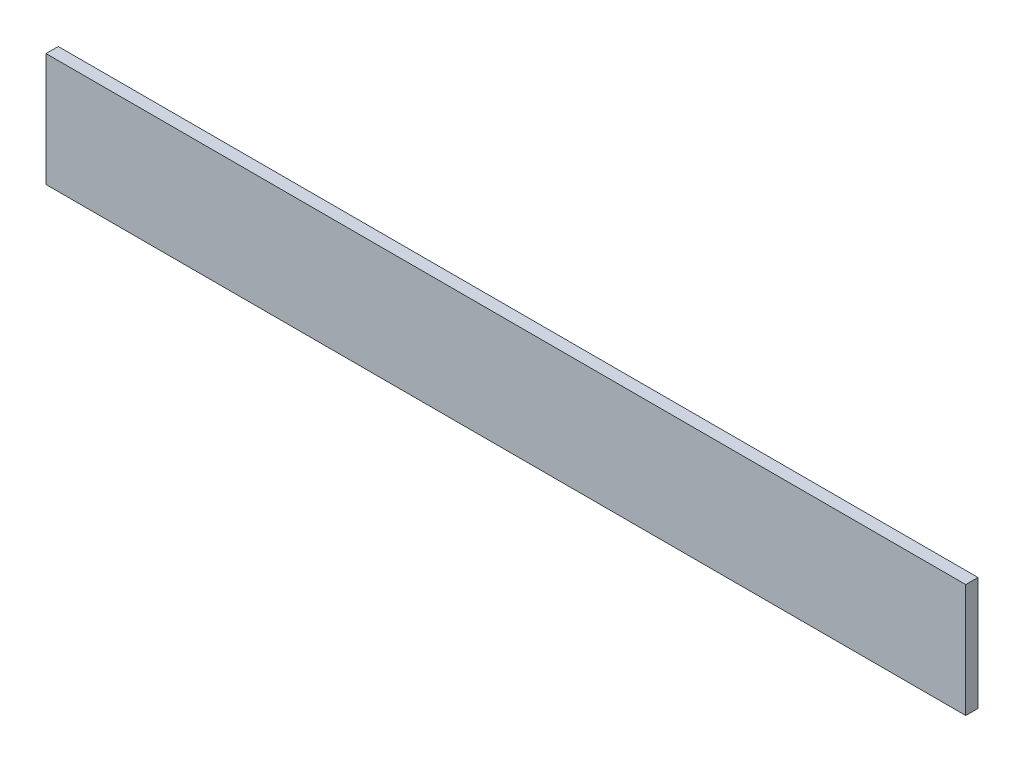
ISO-10303-21;
HEADER;
FILE_DESCRIPTION(('STEP AP214'),'2;1');
FILE_NAME('part.step','',(''),(''),'','','');
FILE_SCHEMA(('AUTOMOTIVE_DESIGN { 1 0 10303 214 1 1 1 1 }'));
ENDSEC;
DATA;
#1=APPLICATION_CONTEXT('core data for automotive mechanical design processes');
#2=APPLICATION_PROTOCOL_DEFINITION('international standard','automotive_design',2000,#1);
#3=PRODUCT_CONTEXT('',#1,'mechanical');
#4=PRODUCT('Part','Part','',(#3));
#5=PRODUCT_RELATED_PRODUCT_CATEGORY('part','',(#4));
#6=PRODUCT_DEFINITION_FORMATION('','',#4);
#7=PRODUCT_DEFINITION_CONTEXT('part definition',#1,'design');
#8=PRODUCT_DEFINITION('design','',#6,#7);
#9=PRODUCT_DEFINITION_SHAPE('','',#8);
#10=(LENGTH_UNIT() NAMED_UNIT(*) SI_UNIT(.MILLI.,.METRE.));
#11=(NAMED_UNIT(*) PLANE_ANGLE_UNIT() SI_UNIT($,.RADIAN.));
#12=(NAMED_UNIT(*) SI_UNIT($,.STERADIAN.) SOLID_ANGLE_UNIT());
#13=UNCERTAINTY_MEASURE_WITH_UNIT(LENGTH_MEASURE(1.E-05),#10,'distance_accuracy_value','');
#14=(GEOMETRIC_REPRESENTATION_CONTEXT(3) GLOBAL_UNCERTAINTY_ASSIGNED_CONTEXT((#13)) GLOBAL_UNIT_ASSIGNED_CONTEXT((#10,
#11,#12)) REPRESENTATION_CONTEXT('',''));
#15=CARTESIAN_POINT('',(0.,0.,0.));
#16=DIRECTION('',(0.,0.,1.));
#17=DIRECTION('',(1.,0.,0.));
#18=AXIS2_PLACEMENT_3D('',#15,#16,#17);
#19=CARTESIAN_POINT('',(150.,18.5,4.));
#20=DIRECTION('',(-1.,0.,0.));
#21=DIRECTION('',(0.,0.,1.));
#22=AXIS2_PLACEMENT_3D('',#19,#20,#21);
#23=PLANE('',#22);
#24=DIRECTION('',(0.,1.,0.));
#25=VECTOR('',#24,1.);
#26=CARTESIAN_POINT('',(150.,18.5,0.));
#27=LINE('',#26,#25);
#28=CARTESIAN_POINT('',(150.,-18.5,0.));
#29=VERTEX_POINT('',#28);
#30=CARTESIAN_POINT('',(150.,18.5,0.));
#31=VERTEX_POINT('',#30);
#32=EDGE_CURVE('E96',#29,#31,#27,.T.);
#33=ORIENTED_EDGE('',*,*,#32,.T.);
#34=DIRECTION('',(0.,0.,-1.));
#35=VECTOR('',#34,1.);
#36=CARTESIAN_POINT('',(150.,18.5,4.));
#37=LINE('',#36,#35);
#38=CARTESIAN_POINT('',(150.,18.5,4.));
#39=VERTEX_POINT('',#38);
#40=EDGE_CURVE('E11',#39,#31,#37,.T.);
#41=ORIENTED_EDGE('',*,*,#40,.F.);
#42=DIRECTION('',(0.,1.,0.));
#43=VECTOR('',#42,1.);
#44=CARTESIAN_POINT('',(150.,18.5,4.));
#45=LINE('',#44,#43);
#46=CARTESIAN_POINT('',(150.,-18.5,4.));
#47=VERTEX_POINT('',#46);
#48=EDGE_CURVE('E84',#47,#39,#45,.T.);
#49=ORIENTED_EDGE('',*,*,#48,.F.);
#50=DIRECTION('',(0.,0.,-1.));
#51=VECTOR('',#50,1.);
#52=CARTESIAN_POINT('',(150.,-18.5,4.));
#53=LINE('',#52,#51);
#54=EDGE_CURVE('E92',#47,#29,#53,.T.);
#55=ORIENTED_EDGE('',*,*,#54,.T.);
#56=EDGE_LOOP('',(#33,#41,#49,#55));
#57=FACE_BOUND('',#56,.T.);
#58=ADVANCED_FACE('F33',(#57),#23,.F.);
#59=CARTESIAN_POINT('',(-150.,18.5,4.));
#60=DIRECTION('',(0.,-1.,0.));
#61=DIRECTION('',(1.,0.,0.));
#62=AXIS2_PLACEMENT_3D('',#59,#60,#61);
#63=PLANE('',#62);
#64=DIRECTION('',(-1.,0.,0.));
#65=VECTOR('',#64,1.);
#66=CARTESIAN_POINT('',(-150.,18.5,0.));
#67=LINE('',#66,#65);
#68=CARTESIAN_POINT('',(-150.,18.5,0.));
#69=VERTEX_POINT('',#68);
#70=EDGE_CURVE('E88',#31,#69,#67,.T.);
#71=ORIENTED_EDGE('',*,*,#70,.T.);
#72=DIRECTION('',(0.,0.,-1.));
#73=VECTOR('',#72,1.);
#74=CARTESIAN_POINT('',(-150.,18.5,4.));
#75=LINE('',#74,#73);
#76=CARTESIAN_POINT('',(-150.,18.5,4.));
#77=VERTEX_POINT('',#76);
#78=EDGE_CURVE('E41',#77,#69,#75,.T.);
#79=ORIENTED_EDGE('',*,*,#78,.F.);
#80=DIRECTION('',(-1.,0.,0.));
#81=VECTOR('',#80,1.);
#82=CARTESIAN_POINT('',(-150.,18.5,4.));
#83=LINE('',#82,#81);
#84=EDGE_CURVE('E79',#39,#77,#83,.T.);
#85=ORIENTED_EDGE('',*,*,#84,.F.);
#86=ORIENTED_EDGE('',*,*,#40,.T.);
#87=EDGE_LOOP('',(#71,#79,#85,#86));
#88=FACE_BOUND('',#87,.T.);
#89=ADVANCED_FACE('F87',(#88),#63,.F.);
#90=CARTESIAN_POINT('',(-150.,18.5,4.));
#91=DIRECTION('',(1.,0.,0.));
#92=DIRECTION('',(0.,0.,-1.));
#93=AXIS2_PLACEMENT_3D('',#90,#91,#92);
#94=PLANE('',#93);
#95=DIRECTION('',(0.,-1.,0.));
#96=VECTOR('',#95,1.);
#97=CARTESIAN_POINT('',(-150.,18.5,0.));
#98=LINE('',#97,#96);
#99=CARTESIAN_POINT('',(-150.,-18.5,0.));
#100=VERTEX_POINT('',#99);
#101=EDGE_CURVE('E66',#69,#100,#98,.T.);
#102=ORIENTED_EDGE('',*,*,#101,.T.);
#103=DIRECTION('',(0.,0.,-1.));
#104=VECTOR('',#103,1.);
#105=CARTESIAN_POINT('',(-150.,-18.5,4.));
#106=LINE('',#105,#104);
#107=CARTESIAN_POINT('',(-150.,-18.5,4.));
#108=VERTEX_POINT('',#107);
#109=EDGE_CURVE('E89',#108,#100,#106,.T.);
#110=ORIENTED_EDGE('',*,*,#109,.F.);
#111=DIRECTION('',(0.,-1.,0.));
#112=VECTOR('',#111,1.);
#113=CARTESIAN_POINT('',(-150.,18.5,4.));
#114=LINE('',#113,#112);
#115=EDGE_CURVE('E82',#77,#108,#114,.T.);
#116=ORIENTED_EDGE('',*,*,#115,.F.);
#117=ORIENTED_EDGE('',*,*,#78,.T.);
#118=EDGE_LOOP('',(#102,#110,#116,#117));
#119=FACE_BOUND('',#118,.T.);
#120=ADVANCED_FACE('F90',(#119),#94,.F.);
#121=CARTESIAN_POINT('',(-150.,-18.5,4.));
#122=DIRECTION('',(0.,1.,0.));
#123=DIRECTION('',(0.,0.,1.));
#124=AXIS2_PLACEMENT_3D('',#121,#122,#123);
#125=PLANE('',#124);
#126=DIRECTION('',(1.,0.,0.));
#127=VECTOR('',#126,1.);
#128=CARTESIAN_POINT('',(-150.,-18.5,0.));
#129=LINE('',#128,#127);
#130=EDGE_CURVE('E72',#100,#29,#129,.T.);
#131=ORIENTED_EDGE('',*,*,#130,.T.);
#132=ORIENTED_EDGE('',*,*,#54,.F.);
#133=DIRECTION('',(1.,0.,0.));
#134=VECTOR('',#133,1.);
#135=CARTESIAN_POINT('',(-150.,-18.5,4.));
#136=LINE('',#135,#134);
#137=EDGE_CURVE('E49',#108,#47,#136,.T.);
#138=ORIENTED_EDGE('',*,*,#137,.F.);
#139=ORIENTED_EDGE('',*,*,#109,.T.);
#140=EDGE_LOOP('',(#131,#132,#138,#139));
#141=FACE_BOUND('',#140,.T.);
#142=ADVANCED_FACE('F103',(#141),#125,.F.);
#143=CARTESIAN_POINT('',(0.,0.,4.));
#144=DIRECTION('',(0.,0.,1.));
#145=DIRECTION('',(1.,0.,0.));
#146=AXIS2_PLACEMENT_3D('',#143,#144,#145);
#147=PLANE('',#146);
#148=ORIENTED_EDGE('',*,*,#48,.T.);
#149=ORIENTED_EDGE('',*,*,#84,.T.);
#150=ORIENTED_EDGE('',*,*,#115,.T.);
#151=ORIENTED_EDGE('',*,*,#137,.T.);
#152=EDGE_LOOP('',(#148,#149,#150,#151));
#153=FACE_BOUND('',#152,.T.);
#154=ADVANCED_FACE('F80',(#153),#147,.T.);
#155=CARTESIAN_POINT('',(0.,0.,0.));
#156=DIRECTION('',(0.,0.,1.));
#157=DIRECTION('',(1.,0.,0.));
#158=AXIS2_PLACEMENT_3D('',#155,#156,#157);
#159=PLANE('',#158);
#160=ORIENTED_EDGE('',*,*,#32,.F.);
#161=ORIENTED_EDGE('',*,*,#130,.F.);
#162=ORIENTED_EDGE('',*,*,#101,.F.);
#163=ORIENTED_EDGE('',*,*,#70,.F.);
#164=EDGE_LOOP('',(#160,#161,#162,#163));
#165=FACE_BOUND('',#164,.T.);
#166=ADVANCED_FACE('F106',(#165),#159,.F.);
#167=CLOSED_SHELL('',(#58,#89,#120,#142,#154,#166));
#168=MANIFOLD_SOLID_BREP('B2',#167);
#169=ADVANCED_BREP_SHAPE_REPRESENTATION('',(#18,#168),#14);
#170=SHAPE_DEFINITION_REPRESENTATION(#9,#169);
ENDSEC;
END-ISO-10303-21;
